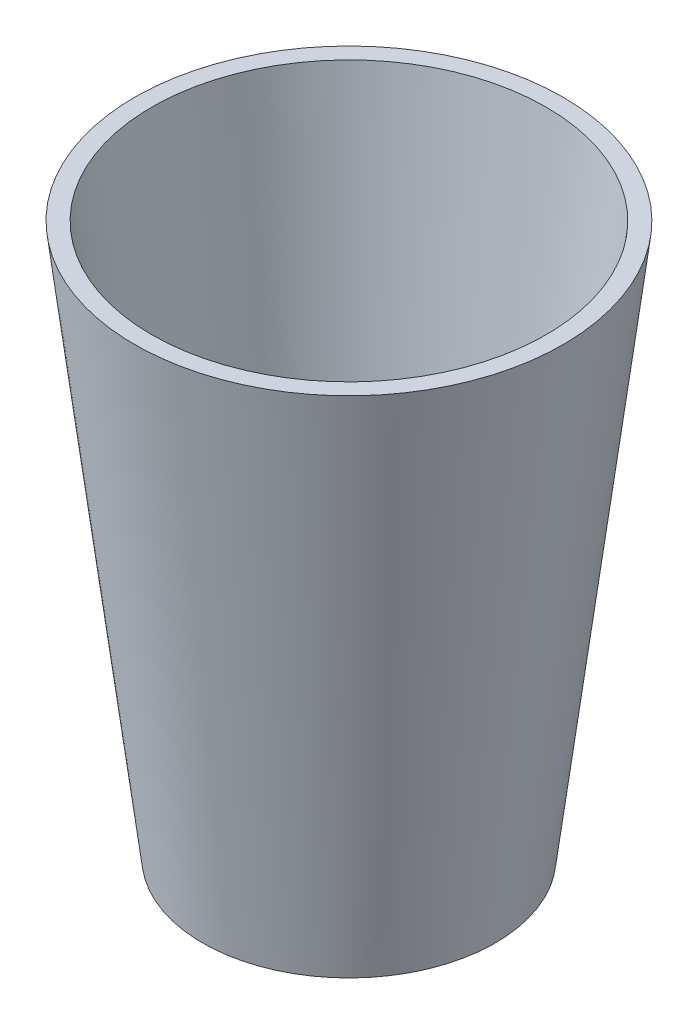
ISO-10303-21;
HEADER;
FILE_DESCRIPTION(('STEP AP214'),'2;1');
FILE_NAME('part.step','',(''),(''),'','','');
FILE_SCHEMA(('AUTOMOTIVE_DESIGN { 1 0 10303 214 1 1 1 1 }'));
ENDSEC;
DATA;
#1=APPLICATION_CONTEXT('core data for automotive mechanical design processes');
#2=APPLICATION_PROTOCOL_DEFINITION('international standard','automotive_design',2000,#1);
#3=PRODUCT_CONTEXT('',#1,'mechanical');
#4=PRODUCT('Part','Part','',(#3));
#5=PRODUCT_RELATED_PRODUCT_CATEGORY('part','',(#4));
#6=PRODUCT_DEFINITION_FORMATION('','',#4);
#7=PRODUCT_DEFINITION_CONTEXT('part definition',#1,'design');
#8=PRODUCT_DEFINITION('design','',#6,#7);
#9=PRODUCT_DEFINITION_SHAPE('','',#8);
#10=(LENGTH_UNIT() NAMED_UNIT(*) SI_UNIT(.MILLI.,.METRE.));
#11=(NAMED_UNIT(*) PLANE_ANGLE_UNIT() SI_UNIT($,.RADIAN.));
#12=(NAMED_UNIT(*) SI_UNIT($,.STERADIAN.) SOLID_ANGLE_UNIT());
#13=UNCERTAINTY_MEASURE_WITH_UNIT(LENGTH_MEASURE(1.E-05),#10,'distance_accuracy_value','');
#14=(GEOMETRIC_REPRESENTATION_CONTEXT(3) GLOBAL_UNCERTAINTY_ASSIGNED_CONTEXT((#13)) GLOBAL_UNIT_ASSIGNED_CONTEXT((#10,
#11,#12)) REPRESENTATION_CONTEXT('',''));
#15=CARTESIAN_POINT('',(0.,0.,0.));
#16=DIRECTION('',(0.,0.,1.));
#17=DIRECTION('',(1.,0.,0.));
#18=AXIS2_PLACEMENT_3D('',#15,#16,#17);
#19=CARTESIAN_POINT('',(0.,0.,0.));
#20=DIRECTION('',(0.,1.,0.));
#21=DIRECTION('',(0.,0.,1.));
#22=AXIS2_PLACEMENT_3D('',#19,#20,#21);
#23=PLANE('',#22);
#24=CARTESIAN_POINT('',(0.,0.,0.));
#25=DIRECTION('',(0.,-1.,0.));
#26=DIRECTION('',(0.,0.,-1.));
#27=AXIS2_PLACEMENT_3D('',#24,#25,#26);
#28=CIRCLE('',#27,23.3354667142244);
#29=CARTESIAN_POINT('',(0.,0.,-23.3354667142244));
#30=VERTEX_POINT('',#29);
#31=EDGE_CURVE('E10',#30,#30,#28,.T.);
#32=ORIENTED_EDGE('',*,*,#31,.F.);
#33=EDGE_LOOP('',(#32));
#34=FACE_BOUND('',#33,.T.);
#35=ADVANCED_FACE('F37',(#34),#23,.T.);
#36=CARTESIAN_POINT('',(0.,95.,0.));
#37=DIRECTION('',(0.,1.,0.));
#38=DIRECTION('',(0.,0.,1.));
#39=AXIS2_PLACEMENT_3D('',#36,#37,#38);
#40=CONICAL_SURFACE('',#39,35.,0.1221730476396);
#41=ORIENTED_EDGE('',*,*,#31,.T.);
#42=EDGE_LOOP('',(#41));
#43=FACE_BOUND('',#42,.T.);
#44=CARTESIAN_POINT('',(0.,95.,0.));
#45=DIRECTION('',(0.,-1.,0.));
#46=DIRECTION('',(0.,0.,-1.));
#47=AXIS2_PLACEMENT_3D('',#44,#45,#46);
#48=CIRCLE('',#47,35.);
#49=CARTESIAN_POINT('',(0.,95.,-35.));
#50=VERTEX_POINT('',#49);
#51=EDGE_CURVE('E44',#50,#50,#48,.T.);
#52=ORIENTED_EDGE('',*,*,#51,.F.);
#53=EDGE_LOOP('',(#52));
#54=FACE_BOUND('',#53,.T.);
#55=ADVANCED_FACE('F73',(#43,#54),#40,.F.);
#56=CARTESIAN_POINT('',(35.,95.,0.));
#57=DIRECTION('',(0.,1.,0.));
#58=DIRECTION('',(0.,0.,1.));
#59=AXIS2_PLACEMENT_3D('',#56,#57,#58);
#60=PLANE('',#59);
#61=ORIENTED_EDGE('',*,*,#51,.T.);
#62=EDGE_LOOP('',(#61));
#63=FACE_BOUND('',#62,.T.);
#64=CARTESIAN_POINT('',(0.,95.,0.));
#65=DIRECTION('',(0.,-1.,0.));
#66=DIRECTION('',(0.,0.,-1.));
#67=AXIS2_PLACEMENT_3D('',#64,#65,#66);
#68=CIRCLE('',#67,38.0225294763765);
#69=CARTESIAN_POINT('',(0.,95.,-38.0225294763765));
#70=VERTEX_POINT('',#69);
#71=EDGE_CURVE('E49',#70,#70,#68,.T.);
#72=ORIENTED_EDGE('',*,*,#71,.F.);
#73=EDGE_LOOP('',(#72));
#74=FACE_BOUND('',#73,.T.);
#75=ADVANCED_FACE('F65',(#63,#74),#60,.T.);
#76=CARTESIAN_POINT('',(0.,-2.99999999999999,0.));
#77=DIRECTION('',(0.,1.,0.));
#78=DIRECTION('',(0.,0.,1.));
#79=AXIS2_PLACEMENT_3D('',#76,#77,#78);
#80=CONICAL_SURFACE('',#79,25.9896425078922,0.1221730476396);
#81=ORIENTED_EDGE('',*,*,#71,.T.);
#82=EDGE_LOOP('',(#81));
#83=FACE_BOUND('',#82,.T.);
#84=CARTESIAN_POINT('',(0.,-2.99999999999999,0.));
#85=DIRECTION('',(0.,-1.,0.));
#86=DIRECTION('',(0.,0.,-1.));
#87=AXIS2_PLACEMENT_3D('',#84,#85,#86);
#88=CIRCLE('',#87,25.9896425078922);
#89=CARTESIAN_POINT('',(0.,-2.99999999999999,-25.9896425078922));
#90=VERTEX_POINT('',#89);
#91=EDGE_CURVE('E54',#90,#90,#88,.T.);
#92=ORIENTED_EDGE('',*,*,#91,.F.);
#93=EDGE_LOOP('',(#92));
#94=FACE_BOUND('',#93,.T.);
#95=ADVANCED_FACE('F63',(#83,#94),#80,.T.);
#96=CARTESIAN_POINT('',(25.9896425078922,-3.,0.));
#97=DIRECTION('',(0.,-1.,0.));
#98=DIRECTION('',(0.,0.,-1.));
#99=AXIS2_PLACEMENT_3D('',#96,#97,#98);
#100=PLANE('',#99);
#101=ORIENTED_EDGE('',*,*,#91,.T.);
#102=EDGE_LOOP('',(#101));
#103=FACE_BOUND('',#102,.T.);
#104=ADVANCED_FACE('F61',(#103),#100,.T.);
#105=CLOSED_SHELL('',(#35,#55,#75,#95,#104));
#106=MANIFOLD_SOLID_BREP('B2',#105);
#107=ADVANCED_BREP_SHAPE_REPRESENTATION('',(#18,#106),#14);
#108=SHAPE_DEFINITION_REPRESENTATION(#9,#107);
ENDSEC;
END-ISO-10303-21;
